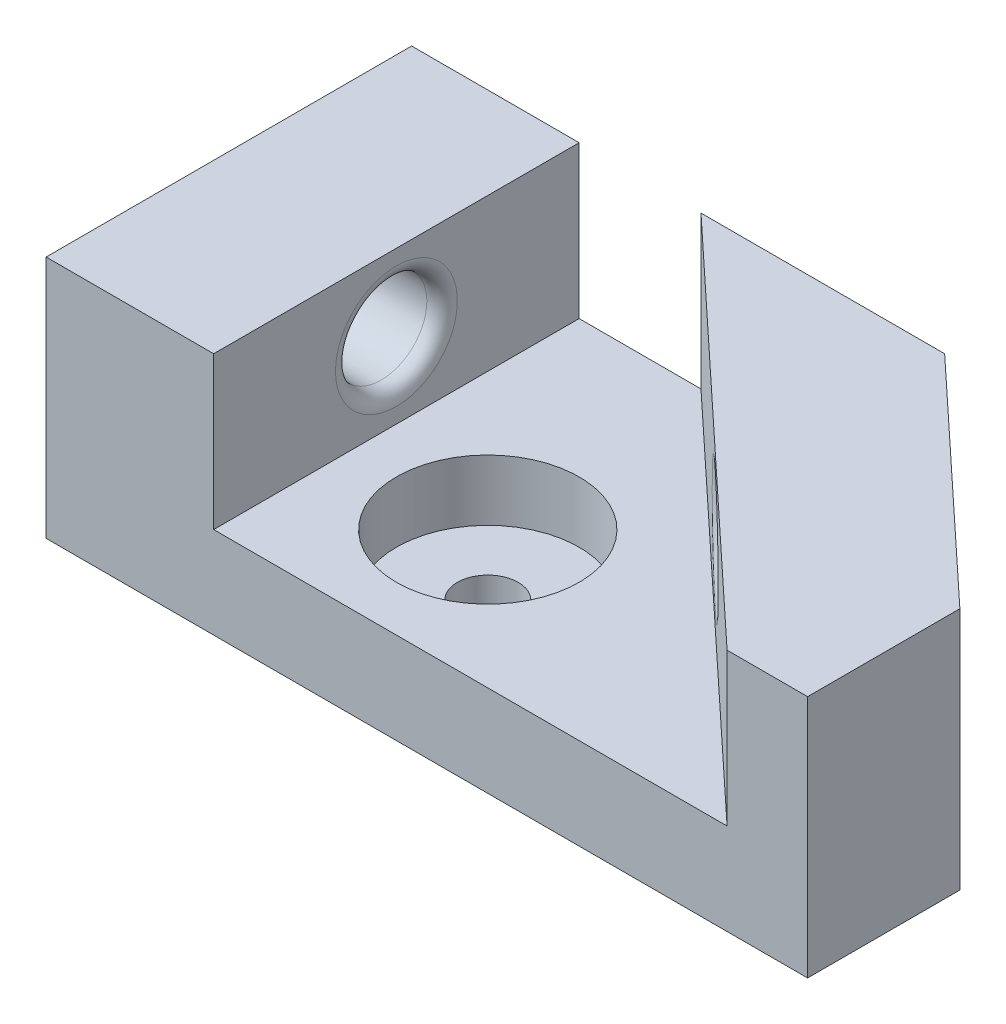
ISO-10303-21;
HEADER;
FILE_DESCRIPTION(('STEP AP214'),'2;1');
FILE_NAME('part.step','',(''),(''),'','','');
FILE_SCHEMA(('AUTOMOTIVE_DESIGN { 1 0 10303 214 1 1 1 1 }'));
ENDSEC;
DATA;
#1=APPLICATION_CONTEXT('core data for automotive mechanical design processes');
#2=APPLICATION_PROTOCOL_DEFINITION('international standard','automotive_design',2000,#1);
#3=PRODUCT_CONTEXT('',#1,'mechanical');
#4=PRODUCT('Part','Part','',(#3));
#5=PRODUCT_RELATED_PRODUCT_CATEGORY('part','',(#4));
#6=PRODUCT_DEFINITION_FORMATION('','',#4);
#7=PRODUCT_DEFINITION_CONTEXT('part definition',#1,'design');
#8=PRODUCT_DEFINITION('design','',#6,#7);
#9=PRODUCT_DEFINITION_SHAPE('','',#8);
#10=(LENGTH_UNIT() NAMED_UNIT(*) SI_UNIT(.MILLI.,.METRE.));
#11=(NAMED_UNIT(*) PLANE_ANGLE_UNIT() SI_UNIT($,.RADIAN.));
#12=(NAMED_UNIT(*) SI_UNIT($,.STERADIAN.) SOLID_ANGLE_UNIT());
#13=UNCERTAINTY_MEASURE_WITH_UNIT(LENGTH_MEASURE(1.E-05),#10,'distance_accuracy_value','');
#14=(GEOMETRIC_REPRESENTATION_CONTEXT(3) GLOBAL_UNCERTAINTY_ASSIGNED_CONTEXT((#13)) GLOBAL_UNIT_ASSIGNED_CONTEXT((#10,
#11,#12)) REPRESENTATION_CONTEXT('',''));
#15=CARTESIAN_POINT('',(0.,0.,0.));
#16=DIRECTION('',(0.,0.,1.));
#17=DIRECTION('',(1.,0.,0.));
#18=AXIS2_PLACEMENT_3D('',#15,#16,#17);
#19=CARTESIAN_POINT('',(0.,2032.,0.));
#20=DIRECTION('',(0.,1.,0.));
#21=DIRECTION('',(0.,0.,1.));
#22=AXIS2_PLACEMENT_3D('',#19,#20,#21);
#23=PLANE('',#22);
#24=DIRECTION('',(-0.731055268242869,0.,-0.682318250360011));
#25=VECTOR('',#24,1.);
#26=CARTESIAN_POINT('',(2305.83893160664,2032.,2662.32294617564));
#27=LINE('',#26,#25);
#28=CARTESIAN_POINT('',(2305.83893160664,2032.,2662.32294617564));
#29=VERTEX_POINT('',#28);
#30=CARTESIAN_POINT('',(-959.875354107649,2032.,-385.677053824364));
#31=VERTEX_POINT('',#30);
#32=EDGE_CURVE('E134',#29,#31,#27,.T.);
#33=ORIENTED_EDGE('',*,*,#32,.F.);
#34=DIRECTION('',(1.,0.,0.));
#35=VECTOR('',#34,1.);
#36=CARTESIAN_POINT('',(-3372.87535410765,2032.,2662.32294617564));
#37=LINE('',#36,#35);
#38=CARTESIAN_POINT('',(2977.12464589235,2032.,2662.32294617564));
#39=VERTEX_POINT('',#38);
#40=EDGE_CURVE('E166',#29,#39,#37,.T.);
#41=ORIENTED_EDGE('',*,*,#40,.T.);
#42=DIRECTION('',(0.,0.,-1.));
#43=VECTOR('',#42,1.);
#44=CARTESIAN_POINT('',(2977.12464589235,2032.,-385.677053824364));
#45=LINE('',#44,#43);
#46=CARTESIAN_POINT('',(2977.12464589235,2032.,1392.32294617564));
#47=VERTEX_POINT('',#46);
#48=EDGE_CURVE('E172',#39,#47,#45,.T.);
#49=ORIENTED_EDGE('',*,*,#48,.T.);
#50=DIRECTION('',(0.731055268242869,0.,0.682318250360011));
#51=VECTOR('',#50,1.);
#52=CARTESIAN_POINT('',(1072.12464589235,2032.,-385.677053824364));
#53=LINE('',#52,#51);
#54=CARTESIAN_POINT('',(1072.12464589235,2032.,-385.677053824364));
#55=VERTEX_POINT('',#54);
#56=EDGE_CURVE('E153',#55,#47,#53,.T.);
#57=ORIENTED_EDGE('',*,*,#56,.F.);
#58=DIRECTION('',(-1.,0.,0.));
#59=VECTOR('',#58,1.);
#60=CARTESIAN_POINT('',(-3372.87535410765,2032.,-385.677053824364));
#61=LINE('',#60,#59);
#62=EDGE_CURVE('E176',#55,#31,#61,.T.);
#63=ORIENTED_EDGE('',*,*,#62,.T.);
#64=EDGE_LOOP('',(#33,#41,#49,#57,#63));
#65=FACE_BOUND('',#64,.T.);
#66=ADVANCED_FACE('F45',(#65),#23,.T.);
#67=CARTESIAN_POINT('',(-3372.87535410765,2032.,-385.677053824364));
#68=DIRECTION('',(1.,0.,0.));
#69=DIRECTION('',(0.,0.,-1.));
#70=AXIS2_PLACEMENT_3D('',#67,#68,#69);
#71=PLANE('',#70);
#72=CARTESIAN_POINT('',(-3372.87535410765,1397.,1138.32294617564));
#73=DIRECTION('',(1.,0.,0.));
#74=DIRECTION('',(0.,0.,-1.));
#75=AXIS2_PLACEMENT_3D('',#72,#73,#74);
#76=CIRCLE('',#75,508.);
#77=CARTESIAN_POINT('',(-3372.87535410765,1397.,630.322946175636));
#78=VERTEX_POINT('',#77);
#79=EDGE_CURVE('E216',#78,#78,#76,.T.);
#80=ORIENTED_EDGE('',*,*,#79,.T.);
#81=EDGE_LOOP('',(#80));
#82=FACE_BOUND('',#81,.T.);
#83=DIRECTION('',(0.,0.,1.));
#84=VECTOR('',#83,1.);
#85=CARTESIAN_POINT('',(-3372.87535410765,0.,-385.677053824364));
#86=LINE('',#85,#84);
#87=CARTESIAN_POINT('',(-3372.87535410765,0.,-385.677053824364));
#88=VERTEX_POINT('',#87);
#89=CARTESIAN_POINT('',(-3372.87535410765,0.,2662.32294617564));
#90=VERTEX_POINT('',#89);
#91=EDGE_CURVE('E159',#88,#90,#86,.T.);
#92=ORIENTED_EDGE('',*,*,#91,.T.);
#93=DIRECTION('',(0.,-1.,0.));
#94=VECTOR('',#93,1.);
#95=CARTESIAN_POINT('',(-3372.87535410765,2032.,2662.32294617564));
#96=LINE('',#95,#94);
#97=CARTESIAN_POINT('',(-3372.87535410765,2032.,2662.32294617564));
#98=VERTEX_POINT('',#97);
#99=EDGE_CURVE('E200',#98,#90,#96,.T.);
#100=ORIENTED_EDGE('',*,*,#99,.F.);
#101=DIRECTION('',(0.,0.,1.));
#102=VECTOR('',#101,1.);
#103=CARTESIAN_POINT('',(-3372.87535410765,2032.,-385.677053824364));
#104=LINE('',#103,#102);
#105=CARTESIAN_POINT('',(-3372.87535410765,2032.,-385.677053824364));
#106=VERTEX_POINT('',#105);
#107=EDGE_CURVE('E162',#106,#98,#104,.T.);
#108=ORIENTED_EDGE('',*,*,#107,.F.);
#109=DIRECTION('',(0.,-1.,0.));
#110=VECTOR('',#109,1.);
#111=CARTESIAN_POINT('',(-3372.87535410765,2032.,-385.677053824364));
#112=LINE('',#111,#110);
#113=EDGE_CURVE('E180',#106,#88,#112,.T.);
#114=ORIENTED_EDGE('',*,*,#113,.T.);
#115=EDGE_LOOP('',(#92,#100,#108,#114));
#116=FACE_BOUND('',#115,.T.);
#117=ADVANCED_FACE('F321',(#82,#116),#71,.F.);
#118=CARTESIAN_POINT('',(-3372.87535410765,2032.,2662.32294617564));
#119=DIRECTION('',(0.,0.,-1.));
#120=DIRECTION('',(-1.,0.,0.));
#121=AXIS2_PLACEMENT_3D('',#118,#119,#120);
#122=PLANE('',#121);
#123=ORIENTED_EDGE('',*,*,#40,.F.);
#124=DIRECTION('',(0.,1.,0.));
#125=VECTOR('',#124,1.);
#126=CARTESIAN_POINT('',(2305.83893160664,762.,2662.32294617564));
#127=LINE('',#126,#125);
#128=CARTESIAN_POINT('',(2305.83893160664,762.,2662.32294617564));
#129=VERTEX_POINT('',#128);
#130=EDGE_CURVE('E144',#129,#29,#127,.T.);
#131=ORIENTED_EDGE('',*,*,#130,.F.);
#132=DIRECTION('',(1.,0.,0.));
#133=VECTOR('',#132,1.);
#134=CARTESIAN_POINT('',(-1975.87535410765,762.,2662.32294617564));
#135=LINE('',#134,#133);
#136=CARTESIAN_POINT('',(-1975.87535410765,762.,2662.32294617564));
#137=VERTEX_POINT('',#136);
#138=EDGE_CURVE('E123',#137,#129,#135,.T.);
#139=ORIENTED_EDGE('',*,*,#138,.F.);
#140=DIRECTION('',(0.,1.,0.));
#141=VECTOR('',#140,1.);
#142=CARTESIAN_POINT('',(-1975.87535410765,762.,2662.32294617564));
#143=LINE('',#142,#141);
#144=CARTESIAN_POINT('',(-1975.87535410765,2032.,2662.32294617564));
#145=VERTEX_POINT('',#144);
#146=EDGE_CURVE('E119',#137,#145,#143,.T.);
#147=ORIENTED_EDGE('',*,*,#146,.T.);
#148=EDGE_CURVE('E168',#98,#145,#37,.T.);
#149=ORIENTED_EDGE('',*,*,#148,.F.);
#150=ORIENTED_EDGE('',*,*,#99,.T.);
#151=DIRECTION('',(1.,0.,0.));
#152=VECTOR('',#151,1.);
#153=CARTESIAN_POINT('',(-3372.87535410765,0.,2662.32294617564));
#154=LINE('',#153,#152);
#155=CARTESIAN_POINT('',(2977.12464589235,0.,2662.32294617564));
#156=VERTEX_POINT('',#155);
#157=EDGE_CURVE('E184',#90,#156,#154,.T.);
#158=ORIENTED_EDGE('',*,*,#157,.T.);
#159=DIRECTION('',(0.,-1.,0.));
#160=VECTOR('',#159,1.);
#161=CARTESIAN_POINT('',(2977.12464589235,2032.,2662.32294617564));
#162=LINE('',#161,#160);
#163=EDGE_CURVE('E196',#39,#156,#162,.T.);
#164=ORIENTED_EDGE('',*,*,#163,.F.);
#165=EDGE_LOOP('',(#123,#131,#139,#147,#149,#150,#158,#164));
#166=FACE_BOUND('',#165,.T.);
#167=ADVANCED_FACE('F258',(#166),#122,.F.);
#168=CARTESIAN_POINT('',(2977.12464589235,2032.,-385.677053824364));
#169=DIRECTION('',(-1.,0.,0.));
#170=DIRECTION('',(0.,0.,1.));
#171=AXIS2_PLACEMENT_3D('',#168,#169,#170);
#172=PLANE('',#171);
#173=DIRECTION('',(0.,0.,-1.));
#174=VECTOR('',#173,1.);
#175=CARTESIAN_POINT('',(2977.12464589235,0.,-385.677053824364));
#176=LINE('',#175,#174);
#177=CARTESIAN_POINT('',(2977.12464589235,0.,1392.32294617564));
#178=VERTEX_POINT('',#177);
#179=EDGE_CURVE('E187',#156,#178,#176,.T.);
#180=ORIENTED_EDGE('',*,*,#179,.T.);
#181=DIRECTION('',(0.,1.,0.));
#182=VECTOR('',#181,1.);
#183=CARTESIAN_POINT('',(2977.12464589235,0.,1392.32294617564));
#184=LINE('',#183,#182);
#185=EDGE_CURVE('E69',#178,#47,#184,.T.);
#186=ORIENTED_EDGE('',*,*,#185,.T.);
#187=ORIENTED_EDGE('',*,*,#48,.F.);
#188=ORIENTED_EDGE('',*,*,#163,.T.);
#189=EDGE_LOOP('',(#180,#186,#187,#188));
#190=FACE_BOUND('',#189,.T.);
#191=ADVANCED_FACE('F250',(#190),#172,.F.);
#192=CARTESIAN_POINT('',(-3372.87535410765,2032.,-385.677053824364));
#193=DIRECTION('',(0.,0.,1.));
#194=DIRECTION('',(1.,0.,0.));
#195=AXIS2_PLACEMENT_3D('',#192,#193,#194);
#196=PLANE('',#195);
#197=DIRECTION('',(-1.,0.,0.));
#198=VECTOR('',#197,1.);
#199=CARTESIAN_POINT('',(-959.875354107649,762.,-385.677053824364));
#200=LINE('',#199,#198);
#201=CARTESIAN_POINT('',(-959.875354107649,762.,-385.677053824364));
#202=VERTEX_POINT('',#201);
#203=CARTESIAN_POINT('',(-1975.87535410765,762.,-385.677053824364));
#204=VERTEX_POINT('',#203);
#205=EDGE_CURVE('E124',#202,#204,#200,.T.);
#206=ORIENTED_EDGE('',*,*,#205,.F.);
#207=DIRECTION('',(0.,1.,0.));
#208=VECTOR('',#207,1.);
#209=CARTESIAN_POINT('',(-959.875354107649,762.,-385.677053824364));
#210=LINE('',#209,#208);
#211=EDGE_CURVE('E156',#202,#31,#210,.T.);
#212=ORIENTED_EDGE('',*,*,#211,.T.);
#213=ORIENTED_EDGE('',*,*,#62,.F.);
#214=DIRECTION('',(0.,1.,0.));
#215=VECTOR('',#214,1.);
#216=CARTESIAN_POINT('',(1072.12464589235,0.,-385.677053824364));
#217=LINE('',#216,#215);
#218=CARTESIAN_POINT('',(1072.12464589235,0.,-385.677053824364));
#219=VERTEX_POINT('',#218);
#220=EDGE_CURVE('E152',#219,#55,#217,.T.);
#221=ORIENTED_EDGE('',*,*,#220,.F.);
#222=DIRECTION('',(-1.,0.,0.));
#223=VECTOR('',#222,1.);
#224=CARTESIAN_POINT('',(-3372.87535410765,0.,-385.677053824364));
#225=LINE('',#224,#223);
#226=EDGE_CURVE('E167',#219,#88,#225,.T.);
#227=ORIENTED_EDGE('',*,*,#226,.T.);
#228=ORIENTED_EDGE('',*,*,#113,.F.);
#229=CARTESIAN_POINT('',(-1975.87535410765,2032.,-385.677053824364));
#230=VERTEX_POINT('',#229);
#231=EDGE_CURVE('E139',#230,#106,#61,.T.);
#232=ORIENTED_EDGE('',*,*,#231,.F.);
#233=DIRECTION('',(0.,1.,0.));
#234=VECTOR('',#233,1.);
#235=CARTESIAN_POINT('',(-1975.87535410765,762.,-385.677053824364));
#236=LINE('',#235,#234);
#237=EDGE_CURVE('E61',#204,#230,#236,.T.);
#238=ORIENTED_EDGE('',*,*,#237,.F.);
#239=EDGE_LOOP('',(#206,#212,#213,#221,#227,#228,#232,#238));
#240=FACE_BOUND('',#239,.T.);
#241=ADVANCED_FACE('F137',(#240),#196,.F.);
#242=DIRECTION('',(0.,0.,1.));
#243=VECTOR('',#242,1.);
#244=CARTESIAN_POINT('',(-1975.87535410765,2032.,-385.677053824364));
#245=LINE('',#244,#243);
#246=EDGE_CURVE('E269',#230,#145,#245,.T.);
#247=ORIENTED_EDGE('',*,*,#246,.F.);
#248=ORIENTED_EDGE('',*,*,#231,.T.);
#249=ORIENTED_EDGE('',*,*,#107,.T.);
#250=ORIENTED_EDGE('',*,*,#148,.T.);
#251=EDGE_LOOP('',(#247,#248,#249,#250));
#252=FACE_BOUND('',#251,.T.);
#253=ADVANCED_FACE('F323',(#252),#23,.T.);
#254=CARTESIAN_POINT('',(0.,0.,0.));
#255=DIRECTION('',(0.,1.,0.));
#256=DIRECTION('',(0.,0.,1.));
#257=AXIS2_PLACEMENT_3D('',#254,#255,#256);
#258=PLANE('',#257);
#259=CARTESIAN_POINT('',(-832.875354107649,0.,1519.32294617564));
#260=DIRECTION('',(0.,1.,0.));
#261=DIRECTION('',(0.,0.,1.));
#262=AXIS2_PLACEMENT_3D('',#259,#260,#261);
#263=CIRCLE('',#262,254.);
#264=CARTESIAN_POINT('',(-832.875354107649,0.,1773.32294617564));
#265=VERTEX_POINT('',#264);
#266=EDGE_CURVE('E279',#265,#265,#263,.T.);
#267=ORIENTED_EDGE('',*,*,#266,.T.);
#268=EDGE_LOOP('',(#267));
#269=FACE_BOUND('',#268,.T.);
#270=ORIENTED_EDGE('',*,*,#226,.F.);
#271=DIRECTION('',(0.731055268242869,0.,0.682318250360011));
#272=VECTOR('',#271,1.);
#273=CARTESIAN_POINT('',(1072.12464589235,0.,-385.677053824364));
#274=LINE('',#273,#272);
#275=EDGE_CURVE('E149',#219,#178,#274,.T.);
#276=ORIENTED_EDGE('',*,*,#275,.T.);
#277=ORIENTED_EDGE('',*,*,#179,.F.);
#278=ORIENTED_EDGE('',*,*,#157,.F.);
#279=ORIENTED_EDGE('',*,*,#91,.F.);
#280=EDGE_LOOP('',(#270,#276,#277,#278,#279));
#281=FACE_BOUND('',#280,.T.);
#282=ADVANCED_FACE('F242',(#269,#281),#258,.F.);
#283=CARTESIAN_POINT('',(1072.12464589235,0.,-385.677053824364));
#284=DIRECTION('',(-0.682318250360011,0.,0.731055268242869));
#285=DIRECTION('',(0.731055268242869,0.,0.682318250360011));
#286=AXIS2_PLACEMENT_3D('',#283,#284,#285);
#287=PLANE('',#286);
#288=CARTESIAN_POINT('',(1766.3488783186,1397.,262.265563106801));
#289=DIRECTION('',(-0.682318250360011,0.,0.731055268242869));
#290=DIRECTION('',(0.731055268242869,0.,0.682318250360011));
#291=AXIS2_PLACEMENT_3D('',#288,#289,#290);
#292=CIRCLE('',#291,508.);
#293=CARTESIAN_POINT('',(2137.72495458598,1397.,608.883234289686));
#294=VERTEX_POINT('',#293);
#295=EDGE_CURVE('E220',#294,#294,#292,.T.);
#296=ORIENTED_EDGE('',*,*,#295,.T.);
#297=EDGE_LOOP('',(#296));
#298=FACE_BOUND('',#297,.T.);
#299=ORIENTED_EDGE('',*,*,#56,.T.);
#300=ORIENTED_EDGE('',*,*,#185,.F.);
#301=ORIENTED_EDGE('',*,*,#275,.F.);
#302=ORIENTED_EDGE('',*,*,#220,.T.);
#303=EDGE_LOOP('',(#299,#300,#301,#302));
#304=FACE_BOUND('',#303,.T.);
#305=ADVANCED_FACE('F239',(#298,#304),#287,.F.);
#306=CARTESIAN_POINT('',(2305.83893160664,762.,2662.32294617564));
#307=DIRECTION('',(0.682318250360011,0.,-0.731055268242869));
#308=DIRECTION('',(-0.731055268242869,0.,-0.682318250360011));
#309=AXIS2_PLACEMENT_3D('',#306,#307,#308);
#310=PLANE('',#309);
#311=CARTESIAN_POINT('',(820.334626537126,1397.,1275.85226144409));
#312=DIRECTION('',(0.682318250360011,0.,-0.731055268242869));
#313=DIRECTION('',(-0.731055268242869,0.,-0.682318250360011));
#314=AXIS2_PLACEMENT_3D('',#311,#312,#313);
#315=CIRCLE('',#314,508.);
#316=CARTESIAN_POINT('',(448.958550269749,1397.,929.234590261207));
#317=VERTEX_POINT('',#316);
#318=EDGE_CURVE('E11',#317,#317,#315,.T.);
#319=ORIENTED_EDGE('',*,*,#318,.T.);
#320=EDGE_LOOP('',(#319));
#321=FACE_BOUND('',#320,.T.);
#322=ORIENTED_EDGE('',*,*,#32,.T.);
#323=ORIENTED_EDGE('',*,*,#211,.F.);
#324=DIRECTION('',(-0.731055268242869,0.,-0.682318250360011));
#325=VECTOR('',#324,1.);
#326=CARTESIAN_POINT('',(2305.83893160664,762.,2662.32294617564));
#327=LINE('',#326,#325);
#328=EDGE_CURVE('E130',#129,#202,#327,.T.);
#329=ORIENTED_EDGE('',*,*,#328,.F.);
#330=ORIENTED_EDGE('',*,*,#130,.T.);
#331=EDGE_LOOP('',(#322,#323,#329,#330));
#332=FACE_BOUND('',#331,.T.);
#333=ADVANCED_FACE('F241',(#321,#332),#310,.F.);
#334=CARTESIAN_POINT('',(-1975.87535410765,762.,-385.677053824364));
#335=DIRECTION('',(-1.,0.,0.));
#336=DIRECTION('',(0.,0.,1.));
#337=AXIS2_PLACEMENT_3D('',#334,#335,#336);
#338=PLANE('',#337);
#339=CARTESIAN_POINT('',(-1975.87535410765,1397.,1138.32294617564));
#340=DIRECTION('',(-1.,0.,0.));
#341=DIRECTION('',(0.,0.,1.));
#342=AXIS2_PLACEMENT_3D('',#339,#340,#341);
#343=CIRCLE('',#342,508.);
#344=CARTESIAN_POINT('',(-1975.87535410765,1397.,1646.32294617564));
#345=VERTEX_POINT('',#344);
#346=EDGE_CURVE('E212',#345,#345,#343,.T.);
#347=ORIENTED_EDGE('',*,*,#346,.T.);
#348=EDGE_LOOP('',(#347));
#349=FACE_BOUND('',#348,.T.);
#350=ORIENTED_EDGE('',*,*,#246,.T.);
#351=ORIENTED_EDGE('',*,*,#146,.F.);
#352=DIRECTION('',(0.,0.,1.));
#353=VECTOR('',#352,1.);
#354=CARTESIAN_POINT('',(-1975.87535410765,762.,-385.677053824364));
#355=LINE('',#354,#353);
#356=EDGE_CURVE('E115',#204,#137,#355,.T.);
#357=ORIENTED_EDGE('',*,*,#356,.F.);
#358=ORIENTED_EDGE('',*,*,#237,.T.);
#359=EDGE_LOOP('',(#350,#351,#357,#358));
#360=FACE_BOUND('',#359,.T.);
#361=ADVANCED_FACE('F117',(#349,#360),#338,.F.);
#362=CARTESIAN_POINT('',(0.,762.,0.));
#363=DIRECTION('',(0.,1.,0.));
#364=DIRECTION('',(0.,0.,1.));
#365=AXIS2_PLACEMENT_3D('',#362,#363,#364);
#366=PLANE('',#365);
#367=CARTESIAN_POINT('',(-832.875354107649,762.,1519.32294617564));
#368=DIRECTION('',(0.,1.,0.));
#369=DIRECTION('',(0.,0.,1.));
#370=AXIS2_PLACEMENT_3D('',#367,#368,#369);
#371=CIRCLE('',#370,762.);
#372=CARTESIAN_POINT('',(-832.875354107649,762.,2281.32294617564));
#373=VERTEX_POINT('',#372);
#374=EDGE_CURVE('E275',#373,#373,#371,.T.);
#375=ORIENTED_EDGE('',*,*,#374,.F.);
#376=EDGE_LOOP('',(#375));
#377=FACE_BOUND('',#376,.T.);
#378=ORIENTED_EDGE('',*,*,#205,.T.);
#379=ORIENTED_EDGE('',*,*,#356,.T.);
#380=ORIENTED_EDGE('',*,*,#138,.T.);
#381=ORIENTED_EDGE('',*,*,#328,.T.);
#382=EDGE_LOOP('',(#378,#379,#380,#381));
#383=FACE_BOUND('',#382,.T.);
#384=ADVANCED_FACE('F128',(#377,#383),#366,.T.);
#385=CARTESIAN_POINT('',(-832.875354107649,254.,1519.32294617564));
#386=DIRECTION('',(0.,1.,0.));
#387=DIRECTION('',(0.,0.,1.));
#388=AXIS2_PLACEMENT_3D('',#385,#386,#387);
#389=CYLINDRICAL_SURFACE('',#388,762.);
#390=CARTESIAN_POINT('',(-832.875354107649,254.,1519.32294617564));
#391=DIRECTION('',(0.,1.,0.));
#392=DIRECTION('',(0.,0.,1.));
#393=AXIS2_PLACEMENT_3D('',#390,#391,#392);
#394=CIRCLE('',#393,762.);
#395=CARTESIAN_POINT('',(-832.875354107649,254.,2281.32294617564));
#396=VERTEX_POINT('',#395);
#397=EDGE_CURVE('E271',#396,#396,#394,.T.);
#398=ORIENTED_EDGE('',*,*,#397,.F.);
#399=EDGE_LOOP('',(#398));
#400=FACE_BOUND('',#399,.T.);
#401=ORIENTED_EDGE('',*,*,#374,.T.);
#402=EDGE_LOOP('',(#401));
#403=FACE_BOUND('',#402,.T.);
#404=ADVANCED_FACE('F302',(#400,#403),#389,.F.);
#405=CARTESIAN_POINT('',(-832.875354107649,254.,1519.32294617564));
#406=DIRECTION('',(0.,1.,0.));
#407=DIRECTION('',(0.,0.,1.));
#408=AXIS2_PLACEMENT_3D('',#405,#406,#407);
#409=PLANE('',#408);
#410=CARTESIAN_POINT('',(-832.875354107649,254.,1519.32294617564));
#411=DIRECTION('',(0.,1.,0.));
#412=DIRECTION('',(0.,0.,1.));
#413=AXIS2_PLACEMENT_3D('',#410,#411,#412);
#414=CIRCLE('',#413,254.);
#415=CARTESIAN_POINT('',(-832.875354107649,254.,1773.32294617564));
#416=VERTEX_POINT('',#415);
#417=EDGE_CURVE('E283',#416,#416,#414,.T.);
#418=ORIENTED_EDGE('',*,*,#417,.F.);
#419=EDGE_LOOP('',(#418));
#420=FACE_BOUND('',#419,.T.);
#421=ORIENTED_EDGE('',*,*,#397,.T.);
#422=EDGE_LOOP('',(#421));
#423=FACE_BOUND('',#422,.T.);
#424=ADVANCED_FACE('F296',(#420,#423),#409,.T.);
#425=CARTESIAN_POINT('',(-832.875354107649,0.,1519.32294617564));
#426=DIRECTION('',(0.,1.,0.));
#427=DIRECTION('',(0.,0.,1.));
#428=AXIS2_PLACEMENT_3D('',#425,#426,#427);
#429=CYLINDRICAL_SURFACE('',#428,254.);
#430=ORIENTED_EDGE('',*,*,#266,.F.);
#431=EDGE_LOOP('',(#430));
#432=FACE_BOUND('',#431,.T.);
#433=ORIENTED_EDGE('',*,*,#417,.T.);
#434=EDGE_LOOP('',(#433));
#435=FACE_BOUND('',#434,.T.);
#436=ADVANCED_FACE('F292',(#432,#435),#429,.F.);
#437=CARTESIAN_POINT('',(-3372.87535410765,1397.,1138.32294617564));
#438=DIRECTION('',(1.,0.,0.));
#439=DIRECTION('',(0.,0.,-1.));
#440=AXIS2_PLACEMENT_3D('',#437,#438,#439);
#441=CYLINDRICAL_SURFACE('',#440,381.);
#442=CARTESIAN_POINT('',(-2102.87535410765,1397.,1138.32294617564));
#443=DIRECTION('',(-1.,0.,0.));
#444=DIRECTION('',(0.,0.,1.));
#445=AXIS2_PLACEMENT_3D('',#442,#443,#444);
#446=CIRCLE('',#445,381.);
#447=CARTESIAN_POINT('',(-2102.87535410765,1397.,1519.32294617564));
#448=VERTEX_POINT('',#447);
#449=EDGE_CURVE('E208',#448,#448,#446,.F.);
#450=ORIENTED_EDGE('',*,*,#449,.T.);
#451=EDGE_LOOP('',(#450));
#452=FACE_BOUND('',#451,.T.);
#453=CARTESIAN_POINT('',(-3245.87535410765,1397.,1138.32294617564));
#454=DIRECTION('',(1.,0.,0.));
#455=DIRECTION('',(0.,0.,-1.));
#456=AXIS2_PLACEMENT_3D('',#453,#454,#455);
#457=CIRCLE('',#456,381.);
#458=CARTESIAN_POINT('',(-3245.87535410765,1397.,757.322946175636));
#459=VERTEX_POINT('',#458);
#460=EDGE_CURVE('E204',#459,#459,#457,.F.);
#461=ORIENTED_EDGE('',*,*,#460,.T.);
#462=EDGE_LOOP('',(#461));
#463=FACE_BOUND('',#462,.T.);
#464=ADVANCED_FACE('F295',(#452,#463),#441,.F.);
#465=CARTESIAN_POINT('',(-2102.87535410765,1397.,1138.32294617564));
#466=DIRECTION('',(-1.,0.,0.));
#467=DIRECTION('',(0.,0.,1.));
#468=AXIS2_PLACEMENT_3D('',#465,#466,#467);
#469=TOROIDAL_SURFACE('',#468,508.,127.);
#470=ORIENTED_EDGE('',*,*,#346,.F.);
#471=EDGE_LOOP('',(#470));
#472=FACE_BOUND('',#471,.T.);
#473=ORIENTED_EDGE('',*,*,#449,.F.);
#474=EDGE_LOOP('',(#473));
#475=FACE_BOUND('',#474,.T.);
#476=ADVANCED_FACE('F353',(#472,#475),#469,.T.);
#477=CARTESIAN_POINT('',(-3245.87535410765,1397.,1138.32294617564));
#478=DIRECTION('',(1.,0.,0.));
#479=DIRECTION('',(0.,0.,-1.));
#480=AXIS2_PLACEMENT_3D('',#477,#478,#479);
#481=TOROIDAL_SURFACE('',#480,508.,127.);
#482=ORIENTED_EDGE('',*,*,#460,.F.);
#483=EDGE_LOOP('',(#482));
#484=FACE_BOUND('',#483,.T.);
#485=ORIENTED_EDGE('',*,*,#79,.F.);
#486=EDGE_LOOP('',(#485));
#487=FACE_BOUND('',#486,.T.);
#488=ADVANCED_FACE('F348',(#484,#487),#481,.T.);
#489=CARTESIAN_POINT('',(2653.23723936373,1397.,-687.971966584411));
#490=DIRECTION('',(-0.682318250360011,0.,0.731055268242869));
#491=DIRECTION('',(0.731055268242869,0.,0.682318250360011));
#492=AXIS2_PLACEMENT_3D('',#489,#490,#491);
#493=CYLINDRICAL_SURFACE('',#492,381.);
#494=CARTESIAN_POINT('',(1679.69446052288,1397.,355.109582173645));
#495=DIRECTION('',(-0.682318250360011,0.,0.731055268242869));
#496=DIRECTION('',(0.731055268242869,0.,0.682318250360011));
#497=AXIS2_PLACEMENT_3D('',#494,#495,#496);
#498=CIRCLE('',#497,381.);
#499=CARTESIAN_POINT('',(1958.22651772341,1397.,615.072835560809));
#500=VERTEX_POINT('',#499);
#501=EDGE_CURVE('E54',#500,#500,#498,.F.);
#502=ORIENTED_EDGE('',*,*,#501,.T.);
#503=EDGE_LOOP('',(#502));
#504=FACE_BOUND('',#503,.T.);
#505=CARTESIAN_POINT('',(906.989044332848,1397.,1183.00824237725));
#506=DIRECTION('',(0.682318250360011,0.,-0.731055268242869));
#507=DIRECTION('',(-0.731055268242869,0.,-0.682318250360011));
#508=AXIS2_PLACEMENT_3D('',#505,#506,#507);
#509=CIRCLE('',#508,381.);
#510=CARTESIAN_POINT('',(628.456987132315,1397.,923.044988990084));
#511=VERTEX_POINT('',#510);
#512=EDGE_CURVE('E224',#511,#511,#509,.F.);
#513=ORIENTED_EDGE('',*,*,#512,.T.);
#514=EDGE_LOOP('',(#513));
#515=FACE_BOUND('',#514,.T.);
#516=ADVANCED_FACE('F231',(#504,#515),#493,.F.);
#517=CARTESIAN_POINT('',(1679.69446052288,1397.,355.109582173645));
#518=DIRECTION('',(-0.682318250360011,0.,0.731055268242869));
#519=DIRECTION('',(0.731055268242869,0.,0.682318250360011));
#520=AXIS2_PLACEMENT_3D('',#517,#518,#519);
#521=TOROIDAL_SURFACE('',#520,508.,127.);
#522=ORIENTED_EDGE('',*,*,#501,.F.);
#523=EDGE_LOOP('',(#522));
#524=FACE_BOUND('',#523,.T.);
#525=ORIENTED_EDGE('',*,*,#295,.F.);
#526=EDGE_LOOP('',(#525));
#527=FACE_BOUND('',#526,.T.);
#528=ADVANCED_FACE('F234',(#524,#527),#521,.T.);
#529=CARTESIAN_POINT('',(906.989044332848,1397.,1183.00824237725));
#530=DIRECTION('',(0.682318250360011,0.,-0.731055268242869));
#531=DIRECTION('',(-0.731055268242869,0.,-0.682318250360011));
#532=AXIS2_PLACEMENT_3D('',#529,#530,#531);
#533=TOROIDAL_SURFACE('',#532,508.,127.);
#534=ORIENTED_EDGE('',*,*,#318,.F.);
#535=EDGE_LOOP('',(#534));
#536=FACE_BOUND('',#535,.T.);
#537=ORIENTED_EDGE('',*,*,#512,.F.);
#538=EDGE_LOOP('',(#537));
#539=FACE_BOUND('',#538,.T.);
#540=ADVANCED_FACE('F47',(#536,#539),#533,.T.);
#541=CLOSED_SHELL('',(#66,#117,#167,#191,#241,#253,#282,#305,#333,#361,#384,#404,#424,#436,#464,
#476,#488,#516,#528,#540));
#542=MANIFOLD_SOLID_BREP('B2',#541);
#543=ADVANCED_BREP_SHAPE_REPRESENTATION('',(#18,#542),#14);
#544=SHAPE_DEFINITION_REPRESENTATION(#9,#543);
ENDSEC;
END-ISO-10303-21;
